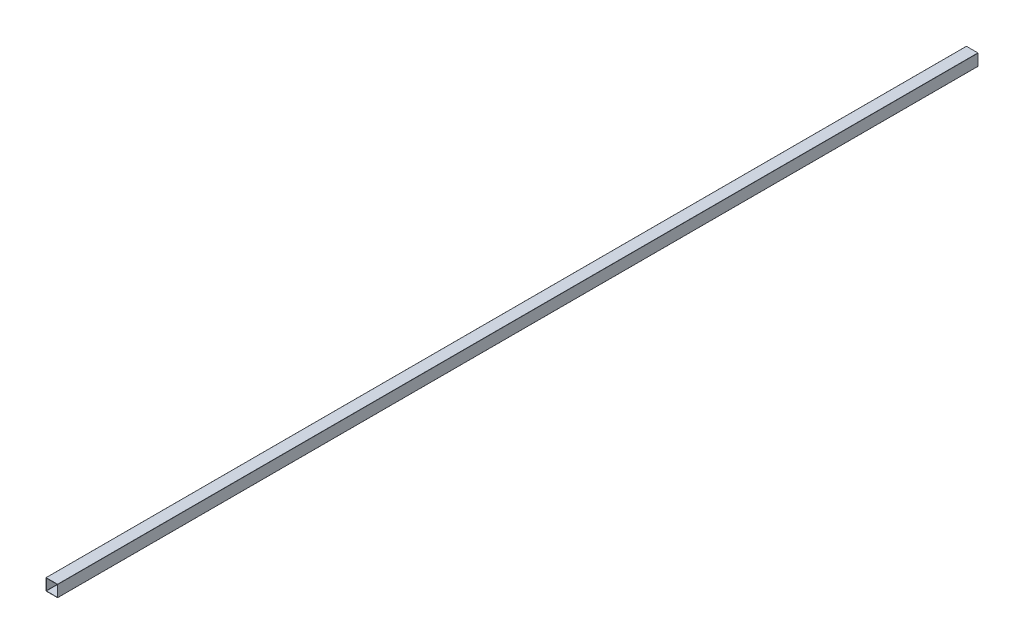
ISO-10303-21;
HEADER;
FILE_DESCRIPTION(('STEP AP214'),'2;1');
FILE_NAME('part.step','',(''),(''),'','','');
FILE_SCHEMA(('AUTOMOTIVE_DESIGN { 1 0 10303 214 1 1 1 1 }'));
ENDSEC;
DATA;
#1=APPLICATION_CONTEXT('core data for automotive mechanical design processes');
#2=APPLICATION_PROTOCOL_DEFINITION('international standard','automotive_design',2000,#1);
#3=PRODUCT_CONTEXT('',#1,'mechanical');
#4=PRODUCT('Part','Part','',(#3));
#5=PRODUCT_RELATED_PRODUCT_CATEGORY('part','',(#4));
#6=PRODUCT_DEFINITION_FORMATION('','',#4);
#7=PRODUCT_DEFINITION_CONTEXT('part definition',#1,'design');
#8=PRODUCT_DEFINITION('design','',#6,#7);
#9=PRODUCT_DEFINITION_SHAPE('','',#8);
#10=(LENGTH_UNIT() NAMED_UNIT(*) SI_UNIT(.MILLI.,.METRE.));
#11=(NAMED_UNIT(*) PLANE_ANGLE_UNIT() SI_UNIT($,.RADIAN.));
#12=(NAMED_UNIT(*) SI_UNIT($,.STERADIAN.) SOLID_ANGLE_UNIT());
#13=UNCERTAINTY_MEASURE_WITH_UNIT(LENGTH_MEASURE(1.E-05),#10,'distance_accuracy_value','');
#14=(GEOMETRIC_REPRESENTATION_CONTEXT(3) GLOBAL_UNCERTAINTY_ASSIGNED_CONTEXT((#13)) GLOBAL_UNIT_ASSIGNED_CONTEXT((#10,
#11,#12)) REPRESENTATION_CONTEXT('',''));
#15=CARTESIAN_POINT('',(0.,0.,0.));
#16=DIRECTION('',(0.,0.,1.));
#17=DIRECTION('',(1.,0.,0.));
#18=AXIS2_PLACEMENT_3D('',#15,#16,#17);
#19=CARTESIAN_POINT('',(38.1,-38.1,-6000.));
#20=DIRECTION('',(1.,0.,0.));
#21=DIRECTION('',(0.,0.,-1.));
#22=AXIS2_PLACEMENT_3D('',#19,#20,#21);
#23=PLANE('',#22);
#24=DIRECTION('',(0.,1.,0.));
#25=VECTOR('',#24,1.);
#26=CARTESIAN_POINT('',(38.1,-38.1,0.));
#27=LINE('',#26,#25);
#28=CARTESIAN_POINT('',(38.1,-37.1,0.));
#29=VERTEX_POINT('',#28);
#30=CARTESIAN_POINT('',(38.1,37.1,0.));
#31=VERTEX_POINT('',#30);
#32=EDGE_CURVE('E197',#29,#31,#27,.T.);
#33=ORIENTED_EDGE('',*,*,#32,.F.);
#34=DIRECTION('',(0.,0.,1.));
#35=VECTOR('',#34,1.);
#36=CARTESIAN_POINT('',(38.1,-37.1,-6000.));
#37=LINE('',#36,#35);
#38=CARTESIAN_POINT('',(38.1,-37.1,-6000.));
#39=VERTEX_POINT('',#38);
#40=EDGE_CURVE('E158',#29,#39,#37,.F.);
#41=ORIENTED_EDGE('',*,*,#40,.T.);
#42=DIRECTION('',(0.,1.,0.));
#43=VECTOR('',#42,1.);
#44=CARTESIAN_POINT('',(38.1,-38.1,-6000.));
#45=LINE('',#44,#43);
#46=CARTESIAN_POINT('',(38.1,37.1,-6000.));
#47=VERTEX_POINT('',#46);
#48=EDGE_CURVE('E185',#39,#47,#45,.T.);
#49=ORIENTED_EDGE('',*,*,#48,.T.);
#50=DIRECTION('',(0.,0.,1.));
#51=VECTOR('',#50,1.);
#52=CARTESIAN_POINT('',(38.1,37.1,-6000.));
#53=LINE('',#52,#51);
#54=EDGE_CURVE('E251',#47,#31,#53,.T.);
#55=ORIENTED_EDGE('',*,*,#54,.T.);
#56=EDGE_LOOP('',(#33,#41,#49,#55));
#57=FACE_BOUND('',#56,.T.);
#58=ADVANCED_FACE('F33',(#57),#23,.T.);
#59=CARTESIAN_POINT('',(-38.1,-38.1,-6000.));
#60=DIRECTION('',(0.,-1.,0.));
#61=DIRECTION('',(0.,0.,-1.));
#62=AXIS2_PLACEMENT_3D('',#59,#60,#61);
#63=PLANE('',#62);
#64=DIRECTION('',(1.,0.,0.));
#65=VECTOR('',#64,1.);
#66=CARTESIAN_POINT('',(-38.1,-38.1,0.));
#67=LINE('',#66,#65);
#68=CARTESIAN_POINT('',(-37.1,-38.1,0.));
#69=VERTEX_POINT('',#68);
#70=CARTESIAN_POINT('',(37.1,-38.1,0.));
#71=VERTEX_POINT('',#70);
#72=EDGE_CURVE('E189',#69,#71,#67,.T.);
#73=ORIENTED_EDGE('',*,*,#72,.F.);
#74=DIRECTION('',(0.,0.,1.));
#75=VECTOR('',#74,1.);
#76=CARTESIAN_POINT('',(-37.1,-38.1,-6000.));
#77=LINE('',#76,#75);
#78=CARTESIAN_POINT('',(-37.1,-38.1,-6000.));
#79=VERTEX_POINT('',#78);
#80=EDGE_CURVE('E238',#69,#79,#77,.F.);
#81=ORIENTED_EDGE('',*,*,#80,.T.);
#82=DIRECTION('',(1.,0.,0.));
#83=VECTOR('',#82,1.);
#84=CARTESIAN_POINT('',(-38.1,-38.1,-6000.));
#85=LINE('',#84,#83);
#86=CARTESIAN_POINT('',(37.1,-38.1,-6000.));
#87=VERTEX_POINT('',#86);
#88=EDGE_CURVE('E194',#79,#87,#85,.T.);
#89=ORIENTED_EDGE('',*,*,#88,.T.);
#90=DIRECTION('',(0.,0.,1.));
#91=VECTOR('',#90,1.);
#92=CARTESIAN_POINT('',(37.1,-38.1,-6000.));
#93=LINE('',#92,#91);
#94=EDGE_CURVE('E235',#87,#71,#93,.T.);
#95=ORIENTED_EDGE('',*,*,#94,.T.);
#96=EDGE_LOOP('',(#73,#81,#89,#95));
#97=FACE_BOUND('',#96,.T.);
#98=ADVANCED_FACE('F305',(#97),#63,.T.);
#99=CARTESIAN_POINT('',(-38.1,-38.1,-6000.));
#100=DIRECTION('',(-1.,0.,0.));
#101=DIRECTION('',(0.,0.,1.));
#102=AXIS2_PLACEMENT_3D('',#99,#100,#101);
#103=PLANE('',#102);
#104=DIRECTION('',(0.,-1.,0.));
#105=VECTOR('',#104,1.);
#106=CARTESIAN_POINT('',(-38.1,-38.1,-6000.));
#107=LINE('',#106,#105);
#108=CARTESIAN_POINT('',(-38.1,37.1,-6000.));
#109=VERTEX_POINT('',#108);
#110=CARTESIAN_POINT('',(-38.1,-37.1,-6000.));
#111=VERTEX_POINT('',#110);
#112=EDGE_CURVE('E191',#109,#111,#107,.T.);
#113=ORIENTED_EDGE('',*,*,#112,.T.);
#114=DIRECTION('',(0.,0.,1.));
#115=VECTOR('',#114,1.);
#116=CARTESIAN_POINT('',(-38.1,-37.1,-6000.));
#117=LINE('',#116,#115);
#118=CARTESIAN_POINT('',(-38.1,-37.1,0.));
#119=VERTEX_POINT('',#118);
#120=EDGE_CURVE('E224',#111,#119,#117,.T.);
#121=ORIENTED_EDGE('',*,*,#120,.T.);
#122=DIRECTION('',(0.,-1.,0.));
#123=VECTOR('',#122,1.);
#124=CARTESIAN_POINT('',(-38.1,-38.1,0.));
#125=LINE('',#124,#123);
#126=CARTESIAN_POINT('',(-38.1,37.1,0.));
#127=VERTEX_POINT('',#126);
#128=EDGE_CURVE('E203',#127,#119,#125,.T.);
#129=ORIENTED_EDGE('',*,*,#128,.F.);
#130=DIRECTION('',(0.,0.,1.));
#131=VECTOR('',#130,1.);
#132=CARTESIAN_POINT('',(-38.1,37.1,-6000.));
#133=LINE('',#132,#131);
#134=EDGE_CURVE('E222',#127,#109,#133,.F.);
#135=ORIENTED_EDGE('',*,*,#134,.T.);
#136=EDGE_LOOP('',(#113,#121,#129,#135));
#137=FACE_BOUND('',#136,.T.);
#138=ADVANCED_FACE('F311',(#137),#103,.T.);
#139=CARTESIAN_POINT('',(-38.1,38.1,-6000.));
#140=DIRECTION('',(0.,1.,0.));
#141=DIRECTION('',(0.,0.,1.));
#142=AXIS2_PLACEMENT_3D('',#139,#140,#141);
#143=PLANE('',#142);
#144=DIRECTION('',(-1.,0.,0.));
#145=VECTOR('',#144,1.);
#146=CARTESIAN_POINT('',(-38.1,38.1,-6000.));
#147=LINE('',#146,#145);
#148=CARTESIAN_POINT('',(37.1,38.1,-6000.));
#149=VERTEX_POINT('',#148);
#150=CARTESIAN_POINT('',(-37.1,38.1,-6000.));
#151=VERTEX_POINT('',#150);
#152=EDGE_CURVE('E188',#149,#151,#147,.T.);
#153=ORIENTED_EDGE('',*,*,#152,.T.);
#154=DIRECTION('',(0.,0.,1.));
#155=VECTOR('',#154,1.);
#156=CARTESIAN_POINT('',(-37.1,38.1,-6000.));
#157=LINE('',#156,#155);
#158=CARTESIAN_POINT('',(-37.1,38.1,0.));
#159=VERTEX_POINT('',#158);
#160=EDGE_CURVE('E248',#151,#159,#157,.T.);
#161=ORIENTED_EDGE('',*,*,#160,.T.);
#162=DIRECTION('',(-1.,0.,0.));
#163=VECTOR('',#162,1.);
#164=CARTESIAN_POINT('',(-38.1,38.1,0.));
#165=LINE('',#164,#163);
#166=CARTESIAN_POINT('',(37.1,38.1,0.));
#167=VERTEX_POINT('',#166);
#168=EDGE_CURVE('E200',#167,#159,#165,.T.);
#169=ORIENTED_EDGE('',*,*,#168,.F.);
#170=DIRECTION('',(0.,0.,1.));
#171=VECTOR('',#170,1.);
#172=CARTESIAN_POINT('',(37.1,38.1,-6000.));
#173=LINE('',#172,#171);
#174=EDGE_CURVE('E55',#167,#149,#173,.F.);
#175=ORIENTED_EDGE('',*,*,#174,.T.);
#176=EDGE_LOOP('',(#153,#161,#169,#175));
#177=FACE_BOUND('',#176,.T.);
#178=ADVANCED_FACE('F316',(#177),#143,.T.);
#179=CARTESIAN_POINT('',(0.,0.,-6000.));
#180=DIRECTION('',(0.,0.,-1.));
#181=DIRECTION('',(-1.,0.,0.));
#182=AXIS2_PLACEMENT_3D('',#179,#180,#181);
#183=PLANE('',#182);
#184=DIRECTION('',(0.,-1.,0.));
#185=VECTOR('',#184,1.);
#186=CARTESIAN_POINT('',(-36.21,-36.21,-6000.));
#187=LINE('',#186,#185);
#188=CARTESIAN_POINT('',(-36.21,35.21,-6000.));
#189=VERTEX_POINT('',#188);
#190=CARTESIAN_POINT('',(-36.21,-35.21,-6000.));
#191=VERTEX_POINT('',#190);
#192=EDGE_CURVE('E167',#189,#191,#187,.T.);
#193=ORIENTED_EDGE('',*,*,#192,.T.);
#194=CARTESIAN_POINT('',(-35.21,-35.21,-6000.));
#195=DIRECTION('',(0.,0.,-1.));
#196=DIRECTION('',(-1.,0.,0.));
#197=AXIS2_PLACEMENT_3D('',#194,#195,#196);
#198=CIRCLE('',#197,1.);
#199=CARTESIAN_POINT('',(-35.21,-36.21,-6000.));
#200=VERTEX_POINT('',#199);
#201=EDGE_CURVE('E11',#191,#200,#198,.F.);
#202=ORIENTED_EDGE('',*,*,#201,.T.);
#203=DIRECTION('',(1.,0.,0.));
#204=VECTOR('',#203,1.);
#205=CARTESIAN_POINT('',(-36.21,-36.21,-6000.));
#206=LINE('',#205,#204);
#207=CARTESIAN_POINT('',(35.21,-36.21,-6000.));
#208=VERTEX_POINT('',#207);
#209=EDGE_CURVE('E175',#200,#208,#206,.T.);
#210=ORIENTED_EDGE('',*,*,#209,.T.);
#211=CARTESIAN_POINT('',(35.21,-35.21,-6000.));
#212=DIRECTION('',(0.,0.,-1.));
#213=DIRECTION('',(-1.,0.,0.));
#214=AXIS2_PLACEMENT_3D('',#211,#212,#213);
#215=CIRCLE('',#214,1.);
#216=CARTESIAN_POINT('',(36.21,-35.21,-6000.));
#217=VERTEX_POINT('',#216);
#218=EDGE_CURVE('E262',#208,#217,#215,.F.);
#219=ORIENTED_EDGE('',*,*,#218,.T.);
#220=DIRECTION('',(0.,1.,0.));
#221=VECTOR('',#220,1.);
#222=CARTESIAN_POINT('',(36.21,-36.21,-6000.));
#223=LINE('',#222,#221);
#224=CARTESIAN_POINT('',(36.21,35.21,-6000.));
#225=VERTEX_POINT('',#224);
#226=EDGE_CURVE('E179',#217,#225,#223,.T.);
#227=ORIENTED_EDGE('',*,*,#226,.T.);
#228=CARTESIAN_POINT('',(35.21,35.21,-6000.));
#229=DIRECTION('',(0.,0.,-1.));
#230=DIRECTION('',(-1.,0.,0.));
#231=AXIS2_PLACEMENT_3D('',#228,#229,#230);
#232=CIRCLE('',#231,1.);
#233=CARTESIAN_POINT('',(35.21,36.21,-6000.));
#234=VERTEX_POINT('',#233);
#235=EDGE_CURVE('E258',#225,#234,#232,.F.);
#236=ORIENTED_EDGE('',*,*,#235,.T.);
#237=DIRECTION('',(-1.,0.,0.));
#238=VECTOR('',#237,1.);
#239=CARTESIAN_POINT('',(-36.21,36.21,-6000.));
#240=LINE('',#239,#238);
#241=CARTESIAN_POINT('',(-35.21,36.21,-6000.));
#242=VERTEX_POINT('',#241);
#243=EDGE_CURVE('E277',#234,#242,#240,.T.);
#244=ORIENTED_EDGE('',*,*,#243,.T.);
#245=CARTESIAN_POINT('',(-35.21,35.21,-6000.));
#246=DIRECTION('',(0.,0.,-1.));
#247=DIRECTION('',(-1.,0.,0.));
#248=AXIS2_PLACEMENT_3D('',#245,#246,#247);
#249=CIRCLE('',#248,1.);
#250=EDGE_CURVE('E157',#242,#189,#249,.F.);
#251=ORIENTED_EDGE('',*,*,#250,.T.);
#252=EDGE_LOOP('',(#193,#202,#210,#219,#227,#236,#244,#251));
#253=FACE_BOUND('',#252,.T.);
#254=ORIENTED_EDGE('',*,*,#88,.F.);
#255=CARTESIAN_POINT('',(-37.1,-37.1,-6000.));
#256=DIRECTION('',(0.,0.,-1.));
#257=DIRECTION('',(-1.,0.,0.));
#258=AXIS2_PLACEMENT_3D('',#255,#256,#257);
#259=CIRCLE('',#258,1.);
#260=EDGE_CURVE('E245',#79,#111,#259,.T.);
#261=ORIENTED_EDGE('',*,*,#260,.T.);
#262=ORIENTED_EDGE('',*,*,#112,.F.);
#263=CARTESIAN_POINT('',(-37.1,37.1,-6000.));
#264=DIRECTION('',(0.,0.,-1.));
#265=DIRECTION('',(-1.,0.,0.));
#266=AXIS2_PLACEMENT_3D('',#263,#264,#265);
#267=CIRCLE('',#266,1.);
#268=EDGE_CURVE('E48',#109,#151,#267,.T.);
#269=ORIENTED_EDGE('',*,*,#268,.T.);
#270=ORIENTED_EDGE('',*,*,#152,.F.);
#271=CARTESIAN_POINT('',(37.1,37.1,-6000.));
#272=DIRECTION('',(0.,0.,-1.));
#273=DIRECTION('',(-1.,0.,0.));
#274=AXIS2_PLACEMENT_3D('',#271,#272,#273);
#275=CIRCLE('',#274,1.);
#276=EDGE_CURVE('E240',#149,#47,#275,.T.);
#277=ORIENTED_EDGE('',*,*,#276,.T.);
#278=ORIENTED_EDGE('',*,*,#48,.F.);
#279=CARTESIAN_POINT('',(37.1,-37.1,-6000.));
#280=DIRECTION('',(0.,0.,-1.));
#281=DIRECTION('',(-1.,0.,0.));
#282=AXIS2_PLACEMENT_3D('',#279,#280,#281);
#283=CIRCLE('',#282,1.);
#284=EDGE_CURVE('E242',#39,#87,#283,.T.);
#285=ORIENTED_EDGE('',*,*,#284,.T.);
#286=EDGE_LOOP('',(#254,#261,#262,#269,#270,#277,#278,#285));
#287=FACE_BOUND('',#286,.T.);
#288=ADVANCED_FACE('F267',(#253,#287),#183,.T.);
#289=CARTESIAN_POINT('',(0.,0.,0.));
#290=DIRECTION('',(0.,0.,-1.));
#291=DIRECTION('',(-1.,0.,0.));
#292=AXIS2_PLACEMENT_3D('',#289,#290,#291);
#293=PLANE('',#292);
#294=DIRECTION('',(0.,1.,0.));
#295=VECTOR('',#294,1.);
#296=CARTESIAN_POINT('',(36.21,-36.21,0.));
#297=LINE('',#296,#295);
#298=CARTESIAN_POINT('',(36.21,-35.21,0.));
#299=VERTEX_POINT('',#298);
#300=CARTESIAN_POINT('',(36.21,35.21,0.));
#301=VERTEX_POINT('',#300);
#302=EDGE_CURVE('E181',#299,#301,#297,.T.);
#303=ORIENTED_EDGE('',*,*,#302,.F.);
#304=CARTESIAN_POINT('',(35.21,-35.21,0.));
#305=DIRECTION('',(0.,0.,-1.));
#306=DIRECTION('',(-1.,0.,0.));
#307=AXIS2_PLACEMENT_3D('',#304,#305,#306);
#308=CIRCLE('',#307,1.);
#309=CARTESIAN_POINT('',(35.21,-36.21,0.));
#310=VERTEX_POINT('',#309);
#311=EDGE_CURVE('E260',#299,#310,#308,.T.);
#312=ORIENTED_EDGE('',*,*,#311,.T.);
#313=DIRECTION('',(1.,0.,0.));
#314=VECTOR('',#313,1.);
#315=CARTESIAN_POINT('',(-36.21,-36.21,0.));
#316=LINE('',#315,#314);
#317=CARTESIAN_POINT('',(-35.21,-36.21,0.));
#318=VERTEX_POINT('',#317);
#319=EDGE_CURVE('E281',#318,#310,#316,.T.);
#320=ORIENTED_EDGE('',*,*,#319,.F.);
#321=CARTESIAN_POINT('',(-35.21,-35.21,0.));
#322=DIRECTION('',(0.,0.,-1.));
#323=DIRECTION('',(-1.,0.,0.));
#324=AXIS2_PLACEMENT_3D('',#321,#322,#323);
#325=CIRCLE('',#324,1.);
#326=CARTESIAN_POINT('',(-36.21,-35.21,0.));
#327=VERTEX_POINT('',#326);
#328=EDGE_CURVE('E41',#318,#327,#325,.T.);
#329=ORIENTED_EDGE('',*,*,#328,.T.);
#330=DIRECTION('',(0.,-1.,0.));
#331=VECTOR('',#330,1.);
#332=CARTESIAN_POINT('',(-36.21,-36.21,0.));
#333=LINE('',#332,#331);
#334=CARTESIAN_POINT('',(-36.21,35.21,0.));
#335=VERTEX_POINT('',#334);
#336=EDGE_CURVE('E164',#335,#327,#333,.T.);
#337=ORIENTED_EDGE('',*,*,#336,.F.);
#338=CARTESIAN_POINT('',(-35.21,35.21,0.));
#339=DIRECTION('',(0.,0.,-1.));
#340=DIRECTION('',(-1.,0.,0.));
#341=AXIS2_PLACEMENT_3D('',#338,#339,#340);
#342=CIRCLE('',#341,1.);
#343=CARTESIAN_POINT('',(-35.21,36.21,0.));
#344=VERTEX_POINT('',#343);
#345=EDGE_CURVE('E147',#335,#344,#342,.T.);
#346=ORIENTED_EDGE('',*,*,#345,.T.);
#347=DIRECTION('',(-1.,0.,0.));
#348=VECTOR('',#347,1.);
#349=CARTESIAN_POINT('',(-36.21,36.21,0.));
#350=LINE('',#349,#348);
#351=CARTESIAN_POINT('',(35.21,36.21,0.));
#352=VERTEX_POINT('',#351);
#353=EDGE_CURVE('E176',#352,#344,#350,.T.);
#354=ORIENTED_EDGE('',*,*,#353,.F.);
#355=CARTESIAN_POINT('',(35.21,35.21,0.));
#356=DIRECTION('',(0.,0.,-1.));
#357=DIRECTION('',(-1.,0.,0.));
#358=AXIS2_PLACEMENT_3D('',#355,#356,#357);
#359=CIRCLE('',#358,1.);
#360=EDGE_CURVE('E256',#352,#301,#359,.T.);
#361=ORIENTED_EDGE('',*,*,#360,.T.);
#362=EDGE_LOOP('',(#303,#312,#320,#329,#337,#346,#354,#361));
#363=FACE_BOUND('',#362,.T.);
#364=ORIENTED_EDGE('',*,*,#128,.T.);
#365=CARTESIAN_POINT('',(-37.1,-37.1,0.));
#366=DIRECTION('',(0.,0.,-1.));
#367=DIRECTION('',(-1.,0.,0.));
#368=AXIS2_PLACEMENT_3D('',#365,#366,#367);
#369=CIRCLE('',#368,1.);
#370=EDGE_CURVE('E233',#119,#69,#369,.F.);
#371=ORIENTED_EDGE('',*,*,#370,.T.);
#372=ORIENTED_EDGE('',*,*,#72,.T.);
#373=CARTESIAN_POINT('',(37.1,-37.1,0.));
#374=DIRECTION('',(0.,0.,-1.));
#375=DIRECTION('',(-1.,0.,0.));
#376=AXIS2_PLACEMENT_3D('',#373,#374,#375);
#377=CIRCLE('',#376,1.);
#378=EDGE_CURVE('E229',#71,#29,#377,.F.);
#379=ORIENTED_EDGE('',*,*,#378,.T.);
#380=ORIENTED_EDGE('',*,*,#32,.T.);
#381=CARTESIAN_POINT('',(37.1,37.1,0.));
#382=DIRECTION('',(0.,0.,-1.));
#383=DIRECTION('',(-1.,0.,0.));
#384=AXIS2_PLACEMENT_3D('',#381,#382,#383);
#385=CIRCLE('',#384,1.);
#386=EDGE_CURVE('E227',#31,#167,#385,.F.);
#387=ORIENTED_EDGE('',*,*,#386,.T.);
#388=ORIENTED_EDGE('',*,*,#168,.T.);
#389=CARTESIAN_POINT('',(-37.1,37.1,0.));
#390=DIRECTION('',(0.,0.,-1.));
#391=DIRECTION('',(-1.,0.,0.));
#392=AXIS2_PLACEMENT_3D('',#389,#390,#391);
#393=CIRCLE('',#392,1.);
#394=EDGE_CURVE('E231',#159,#127,#393,.F.);
#395=ORIENTED_EDGE('',*,*,#394,.T.);
#396=EDGE_LOOP('',(#364,#371,#372,#379,#380,#387,#388,#395));
#397=FACE_BOUND('',#396,.T.);
#398=ADVANCED_FACE('F172',(#363,#397),#293,.F.);
#399=CARTESIAN_POINT('',(-36.21,-36.21,-6000.));
#400=DIRECTION('',(0.,-1.,0.));
#401=DIRECTION('',(0.,0.,-1.));
#402=AXIS2_PLACEMENT_3D('',#399,#400,#401);
#403=PLANE('',#402);
#404=ORIENTED_EDGE('',*,*,#319,.T.);
#405=DIRECTION('',(0.,0.,1.));
#406=VECTOR('',#405,1.);
#407=CARTESIAN_POINT('',(35.21,-36.21,-6000.));
#408=LINE('',#407,#406);
#409=EDGE_CURVE('E220',#310,#208,#408,.F.);
#410=ORIENTED_EDGE('',*,*,#409,.T.);
#411=ORIENTED_EDGE('',*,*,#209,.F.);
#412=DIRECTION('',(0.,0.,1.));
#413=VECTOR('',#412,1.);
#414=CARTESIAN_POINT('',(-35.21,-36.21,0.));
#415=LINE('',#414,#413);
#416=EDGE_CURVE('E217',#200,#318,#415,.T.);
#417=ORIENTED_EDGE('',*,*,#416,.T.);
#418=EDGE_LOOP('',(#404,#410,#411,#417));
#419=FACE_BOUND('',#418,.T.);
#420=ADVANCED_FACE('F283',(#419),#403,.F.);
#421=CARTESIAN_POINT('',(-36.21,-36.21,-6000.));
#422=DIRECTION('',(-1.,0.,0.));
#423=DIRECTION('',(0.,0.,1.));
#424=AXIS2_PLACEMENT_3D('',#421,#422,#423);
#425=PLANE('',#424);
#426=ORIENTED_EDGE('',*,*,#192,.F.);
#427=DIRECTION('',(0.,0.,1.));
#428=VECTOR('',#427,1.);
#429=CARTESIAN_POINT('',(-36.21,35.21,0.));
#430=LINE('',#429,#428);
#431=EDGE_CURVE('E151',#189,#335,#430,.T.);
#432=ORIENTED_EDGE('',*,*,#431,.T.);
#433=ORIENTED_EDGE('',*,*,#336,.T.);
#434=DIRECTION('',(0.,0.,1.));
#435=VECTOR('',#434,1.);
#436=CARTESIAN_POINT('',(-36.21,-35.21,-6000.));
#437=LINE('',#436,#435);
#438=EDGE_CURVE('E169',#327,#191,#437,.F.);
#439=ORIENTED_EDGE('',*,*,#438,.T.);
#440=EDGE_LOOP('',(#426,#432,#433,#439));
#441=FACE_BOUND('',#440,.T.);
#442=ADVANCED_FACE('F163',(#441),#425,.F.);
#443=CARTESIAN_POINT('',(-36.21,36.21,-6000.));
#444=DIRECTION('',(0.,1.,0.));
#445=DIRECTION('',(0.,0.,1.));
#446=AXIS2_PLACEMENT_3D('',#443,#444,#445);
#447=PLANE('',#446);
#448=ORIENTED_EDGE('',*,*,#353,.T.);
#449=DIRECTION('',(0.,0.,1.));
#450=VECTOR('',#449,1.);
#451=CARTESIAN_POINT('',(-35.21,36.21,-6000.));
#452=LINE('',#451,#450);
#453=EDGE_CURVE('E152',#344,#242,#452,.F.);
#454=ORIENTED_EDGE('',*,*,#453,.T.);
#455=ORIENTED_EDGE('',*,*,#243,.F.);
#456=DIRECTION('',(0.,0.,1.));
#457=VECTOR('',#456,1.);
#458=CARTESIAN_POINT('',(35.21,36.21,0.));
#459=LINE('',#458,#457);
#460=EDGE_CURVE('E168',#234,#352,#459,.T.);
#461=ORIENTED_EDGE('',*,*,#460,.T.);
#462=EDGE_LOOP('',(#448,#454,#455,#461));
#463=FACE_BOUND('',#462,.T.);
#464=ADVANCED_FACE('F292',(#463),#447,.F.);
#465=CARTESIAN_POINT('',(36.21,-36.21,-6000.));
#466=DIRECTION('',(1.,0.,0.));
#467=DIRECTION('',(0.,0.,-1.));
#468=AXIS2_PLACEMENT_3D('',#465,#466,#467);
#469=PLANE('',#468);
#470=ORIENTED_EDGE('',*,*,#302,.T.);
#471=DIRECTION('',(0.,0.,1.));
#472=VECTOR('',#471,1.);
#473=CARTESIAN_POINT('',(36.21,35.21,-6000.));
#474=LINE('',#473,#472);
#475=EDGE_CURVE('E215',#301,#225,#474,.F.);
#476=ORIENTED_EDGE('',*,*,#475,.T.);
#477=ORIENTED_EDGE('',*,*,#226,.F.);
#478=DIRECTION('',(0.,0.,1.));
#479=VECTOR('',#478,1.);
#480=CARTESIAN_POINT('',(36.21,-35.21,0.));
#481=LINE('',#480,#479);
#482=EDGE_CURVE('E212',#217,#299,#481,.T.);
#483=ORIENTED_EDGE('',*,*,#482,.T.);
#484=EDGE_LOOP('',(#470,#476,#477,#483));
#485=FACE_BOUND('',#484,.T.);
#486=ADVANCED_FACE('F275',(#485),#469,.F.);
#487=CARTESIAN_POINT('',(-35.21,35.21,-6000.));
#488=DIRECTION('',(0.,0.,-1.));
#489=DIRECTION('',(-1.,0.,0.));
#490=AXIS2_PLACEMENT_3D('',#487,#488,#489);
#491=CYLINDRICAL_SURFACE('',#490,1.);
#492=ORIENTED_EDGE('',*,*,#250,.F.);
#493=ORIENTED_EDGE('',*,*,#453,.F.);
#494=ORIENTED_EDGE('',*,*,#345,.F.);
#495=ORIENTED_EDGE('',*,*,#431,.F.);
#496=EDGE_LOOP('',(#492,#493,#494,#495));
#497=FACE_BOUND('',#496,.T.);
#498=ADVANCED_FACE('F150',(#497),#491,.F.);
#499=CARTESIAN_POINT('',(35.21,35.21,-6000.));
#500=DIRECTION('',(0.,0.,-1.));
#501=DIRECTION('',(-1.,0.,0.));
#502=AXIS2_PLACEMENT_3D('',#499,#500,#501);
#503=CYLINDRICAL_SURFACE('',#502,1.);
#504=ORIENTED_EDGE('',*,*,#235,.F.);
#505=ORIENTED_EDGE('',*,*,#475,.F.);
#506=ORIENTED_EDGE('',*,*,#360,.F.);
#507=ORIENTED_EDGE('',*,*,#460,.F.);
#508=EDGE_LOOP('',(#504,#505,#506,#507));
#509=FACE_BOUND('',#508,.T.);
#510=ADVANCED_FACE('F294',(#509),#503,.F.);
#511=CARTESIAN_POINT('',(35.21,-35.21,-6000.));
#512=DIRECTION('',(0.,0.,-1.));
#513=DIRECTION('',(-1.,0.,0.));
#514=AXIS2_PLACEMENT_3D('',#511,#512,#513);
#515=CYLINDRICAL_SURFACE('',#514,1.);
#516=ORIENTED_EDGE('',*,*,#218,.F.);
#517=ORIENTED_EDGE('',*,*,#409,.F.);
#518=ORIENTED_EDGE('',*,*,#311,.F.);
#519=ORIENTED_EDGE('',*,*,#482,.F.);
#520=EDGE_LOOP('',(#516,#517,#518,#519));
#521=FACE_BOUND('',#520,.T.);
#522=ADVANCED_FACE('F279',(#521),#515,.F.);
#523=CARTESIAN_POINT('',(-37.1,-37.1,-6000.));
#524=DIRECTION('',(0.,0.,1.));
#525=DIRECTION('',(1.,0.,0.));
#526=AXIS2_PLACEMENT_3D('',#523,#524,#525);
#527=CYLINDRICAL_SURFACE('',#526,1.);
#528=ORIENTED_EDGE('',*,*,#260,.F.);
#529=ORIENTED_EDGE('',*,*,#80,.F.);
#530=ORIENTED_EDGE('',*,*,#370,.F.);
#531=ORIENTED_EDGE('',*,*,#120,.F.);
#532=EDGE_LOOP('',(#528,#529,#530,#531));
#533=FACE_BOUND('',#532,.T.);
#534=ADVANCED_FACE('F301',(#533),#527,.T.);
#535=CARTESIAN_POINT('',(-37.1,37.1,-6000.));
#536=DIRECTION('',(0.,0.,1.));
#537=DIRECTION('',(1.,0.,0.));
#538=AXIS2_PLACEMENT_3D('',#535,#536,#537);
#539=CYLINDRICAL_SURFACE('',#538,1.);
#540=ORIENTED_EDGE('',*,*,#268,.F.);
#541=ORIENTED_EDGE('',*,*,#134,.F.);
#542=ORIENTED_EDGE('',*,*,#394,.F.);
#543=ORIENTED_EDGE('',*,*,#160,.F.);
#544=EDGE_LOOP('',(#540,#541,#542,#543));
#545=FACE_BOUND('',#544,.T.);
#546=ADVANCED_FACE('F368',(#545),#539,.T.);
#547=CARTESIAN_POINT('',(-35.21,-35.21,-6000.));
#548=DIRECTION('',(0.,0.,-1.));
#549=DIRECTION('',(-1.,0.,0.));
#550=AXIS2_PLACEMENT_3D('',#547,#548,#549);
#551=CYLINDRICAL_SURFACE('',#550,1.);
#552=ORIENTED_EDGE('',*,*,#201,.F.);
#553=ORIENTED_EDGE('',*,*,#438,.F.);
#554=ORIENTED_EDGE('',*,*,#328,.F.);
#555=ORIENTED_EDGE('',*,*,#416,.F.);
#556=EDGE_LOOP('',(#552,#553,#554,#555));
#557=FACE_BOUND('',#556,.T.);
#558=ADVANCED_FACE('F378',(#557),#551,.F.);
#559=CARTESIAN_POINT('',(37.1,-37.1,-6000.));
#560=DIRECTION('',(0.,0.,1.));
#561=DIRECTION('',(1.,0.,0.));
#562=AXIS2_PLACEMENT_3D('',#559,#560,#561);
#563=CYLINDRICAL_SURFACE('',#562,1.);
#564=ORIENTED_EDGE('',*,*,#284,.F.);
#565=ORIENTED_EDGE('',*,*,#40,.F.);
#566=ORIENTED_EDGE('',*,*,#378,.F.);
#567=ORIENTED_EDGE('',*,*,#94,.F.);
#568=EDGE_LOOP('',(#564,#565,#566,#567));
#569=FACE_BOUND('',#568,.T.);
#570=ADVANCED_FACE('F388',(#569),#563,.T.);
#571=CARTESIAN_POINT('',(37.1,37.1,-6000.));
#572=DIRECTION('',(0.,0.,1.));
#573=DIRECTION('',(1.,0.,0.));
#574=AXIS2_PLACEMENT_3D('',#571,#572,#573);
#575=CYLINDRICAL_SURFACE('',#574,1.);
#576=ORIENTED_EDGE('',*,*,#276,.F.);
#577=ORIENTED_EDGE('',*,*,#174,.F.);
#578=ORIENTED_EDGE('',*,*,#386,.F.);
#579=ORIENTED_EDGE('',*,*,#54,.F.);
#580=EDGE_LOOP('',(#576,#577,#578,#579));
#581=FACE_BOUND('',#580,.T.);
#582=ADVANCED_FACE('F35',(#581),#575,.T.);
#583=CLOSED_SHELL('',(#58,#98,#138,#178,#288,#398,#420,#442,#464,#486,#498,#510,#522,#534,#546,
#558,#570,#582));
#584=MANIFOLD_SOLID_BREP('B2',#583);
#585=ADVANCED_BREP_SHAPE_REPRESENTATION('',(#18,#584),#14);
#586=SHAPE_DEFINITION_REPRESENTATION(#9,#585);
ENDSEC;
END-ISO-10303-21;
